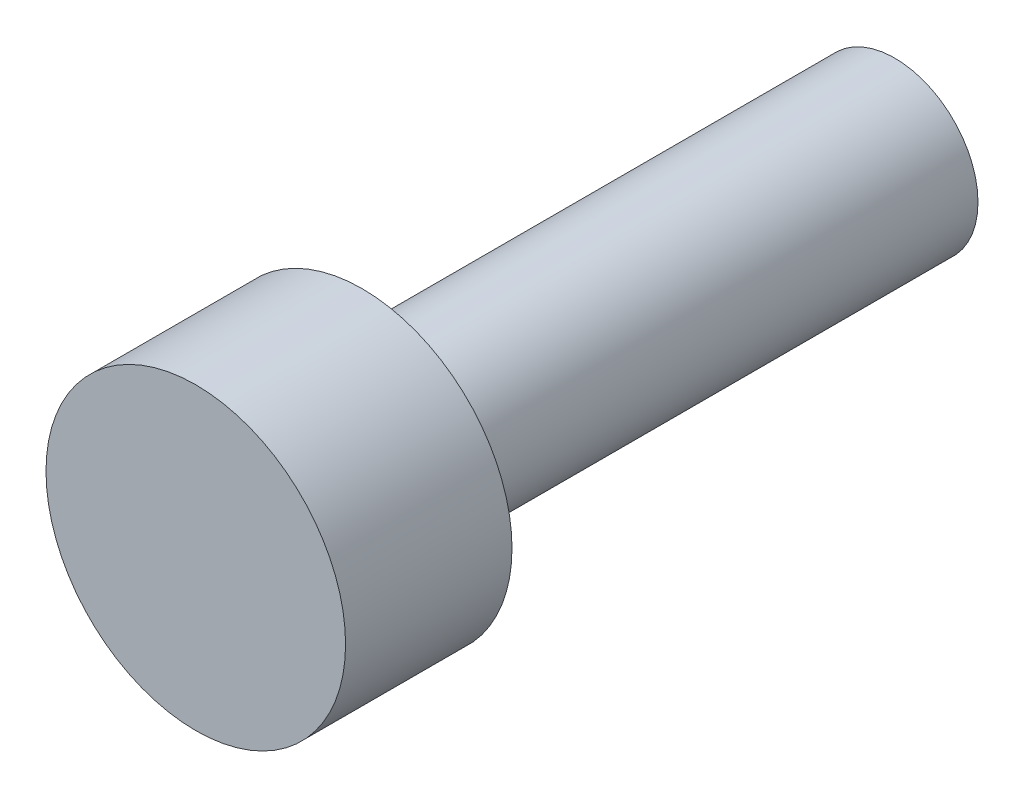
ISO-10303-21;
HEADER;
FILE_DESCRIPTION(('STEP AP214'),'2;1');
FILE_NAME('part.step','',(''),(''),'','','');
FILE_SCHEMA(('AUTOMOTIVE_DESIGN { 1 0 10303 214 1 1 1 1 }'));
ENDSEC;
DATA;
#1=APPLICATION_CONTEXT('core data for automotive mechanical design processes');
#2=APPLICATION_PROTOCOL_DEFINITION('international standard','automotive_design',2000,#1);
#3=PRODUCT_CONTEXT('',#1,'mechanical');
#4=PRODUCT('Part','Part','',(#3));
#5=PRODUCT_RELATED_PRODUCT_CATEGORY('part','',(#4));
#6=PRODUCT_DEFINITION_FORMATION('','',#4);
#7=PRODUCT_DEFINITION_CONTEXT('part definition',#1,'design');
#8=PRODUCT_DEFINITION('design','',#6,#7);
#9=PRODUCT_DEFINITION_SHAPE('','',#8);
#10=(LENGTH_UNIT() NAMED_UNIT(*) SI_UNIT(.MILLI.,.METRE.));
#11=(NAMED_UNIT(*) PLANE_ANGLE_UNIT() SI_UNIT($,.RADIAN.));
#12=(NAMED_UNIT(*) SI_UNIT($,.STERADIAN.) SOLID_ANGLE_UNIT());
#13=UNCERTAINTY_MEASURE_WITH_UNIT(LENGTH_MEASURE(1.E-05),#10,'distance_accuracy_value','');
#14=(GEOMETRIC_REPRESENTATION_CONTEXT(3) GLOBAL_UNCERTAINTY_ASSIGNED_CONTEXT((#13)) GLOBAL_UNIT_ASSIGNED_CONTEXT((#10,
#11,#12)) REPRESENTATION_CONTEXT('',''));
#15=CARTESIAN_POINT('',(0.,0.,0.));
#16=DIRECTION('',(0.,0.,1.));
#17=DIRECTION('',(1.,0.,0.));
#18=AXIS2_PLACEMENT_3D('',#15,#16,#17);
#19=CARTESIAN_POINT('',(0.,0.,16.));
#20=DIRECTION('',(0.,0.,-1.));
#21=DIRECTION('',(-1.,0.,0.));
#22=AXIS2_PLACEMENT_3D('',#19,#20,#21);
#23=CYLINDRICAL_SURFACE('',#22,2.5);
#24=CARTESIAN_POINT('',(0.,0.,16.));
#25=DIRECTION('',(0.,0.,1.));
#26=DIRECTION('',(1.,0.,0.));
#27=AXIS2_PLACEMENT_3D('',#24,#25,#26);
#28=CIRCLE('',#27,2.5);
#29=CARTESIAN_POINT('',(2.5,0.,16.));
#30=VERTEX_POINT('',#29);
#31=EDGE_CURVE('E10',#30,#30,#28,.T.);
#32=ORIENTED_EDGE('',*,*,#31,.F.);
#33=EDGE_LOOP('',(#32));
#34=FACE_BOUND('',#33,.T.);
#35=CARTESIAN_POINT('',(0.,0.,0.));
#36=DIRECTION('',(0.,0.,1.));
#37=DIRECTION('',(1.,0.,0.));
#38=AXIS2_PLACEMENT_3D('',#35,#36,#37);
#39=CIRCLE('',#38,2.5);
#40=CARTESIAN_POINT('',(2.5,0.,0.));
#41=VERTEX_POINT('',#40);
#42=EDGE_CURVE('E37',#41,#41,#39,.T.);
#43=ORIENTED_EDGE('',*,*,#42,.T.);
#44=EDGE_LOOP('',(#43));
#45=FACE_BOUND('',#44,.T.);
#46=ADVANCED_FACE('F40',(#34,#45),#23,.T.);
#47=CARTESIAN_POINT('',(0.,0.,0.));
#48=DIRECTION('',(0.,0.,1.));
#49=DIRECTION('',(1.,0.,0.));
#50=AXIS2_PLACEMENT_3D('',#47,#48,#49);
#51=PLANE('',#50);
#52=ORIENTED_EDGE('',*,*,#42,.F.);
#53=EDGE_LOOP('',(#52));
#54=FACE_BOUND('',#53,.T.);
#55=ADVANCED_FACE('F58',(#54),#51,.F.);
#56=CARTESIAN_POINT('',(0.,0.,21.));
#57=DIRECTION('',(0.,0.,-1.));
#58=DIRECTION('',(-1.,0.,0.));
#59=AXIS2_PLACEMENT_3D('',#56,#57,#58);
#60=CYLINDRICAL_SURFACE('',#59,4.5);
#61=CARTESIAN_POINT('',(0.,0.,21.));
#62=DIRECTION('',(0.,0.,1.));
#63=DIRECTION('',(1.,0.,0.));
#64=AXIS2_PLACEMENT_3D('',#61,#62,#63);
#65=CIRCLE('',#64,4.5);
#66=CARTESIAN_POINT('',(4.5,0.,21.));
#67=VERTEX_POINT('',#66);
#68=EDGE_CURVE('E50',#67,#67,#65,.T.);
#69=ORIENTED_EDGE('',*,*,#68,.F.);
#70=EDGE_LOOP('',(#69));
#71=FACE_BOUND('',#70,.T.);
#72=CARTESIAN_POINT('',(0.,0.,16.));
#73=DIRECTION('',(0.,0.,1.));
#74=DIRECTION('',(1.,0.,0.));
#75=AXIS2_PLACEMENT_3D('',#72,#73,#74);
#76=CIRCLE('',#75,4.5);
#77=CARTESIAN_POINT('',(4.5,0.,16.));
#78=VERTEX_POINT('',#77);
#79=EDGE_CURVE('E47',#78,#78,#76,.T.);
#80=ORIENTED_EDGE('',*,*,#79,.T.);
#81=EDGE_LOOP('',(#80));
#82=FACE_BOUND('',#81,.T.);
#83=ADVANCED_FACE('F60',(#71,#82),#60,.T.);
#84=CARTESIAN_POINT('',(0.,0.,21.));
#85=DIRECTION('',(0.,0.,1.));
#86=DIRECTION('',(1.,0.,0.));
#87=AXIS2_PLACEMENT_3D('',#84,#85,#86);
#88=PLANE('',#87);
#89=ORIENTED_EDGE('',*,*,#68,.T.);
#90=EDGE_LOOP('',(#89));
#91=FACE_BOUND('',#90,.T.);
#92=ADVANCED_FACE('F54',(#91),#88,.T.);
#93=CARTESIAN_POINT('',(0.,0.,16.));
#94=DIRECTION('',(0.,0.,1.));
#95=DIRECTION('',(1.,0.,0.));
#96=AXIS2_PLACEMENT_3D('',#93,#94,#95);
#97=PLANE('',#96);
#98=ORIENTED_EDGE('',*,*,#31,.T.);
#99=EDGE_LOOP('',(#98));
#100=FACE_BOUND('',#99,.T.);
#101=ORIENTED_EDGE('',*,*,#79,.F.);
#102=EDGE_LOOP('',(#101));
#103=FACE_BOUND('',#102,.T.);
#104=ADVANCED_FACE('F62',(#100,#103),#97,.F.);
#105=CLOSED_SHELL('',(#46,#55,#83,#92,#104));
#106=MANIFOLD_SOLID_BREP('B2',#105);
#107=ADVANCED_BREP_SHAPE_REPRESENTATION('',(#18,#106),#14);
#108=SHAPE_DEFINITION_REPRESENTATION(#9,#107);
ENDSEC;
END-ISO-10303-21;
